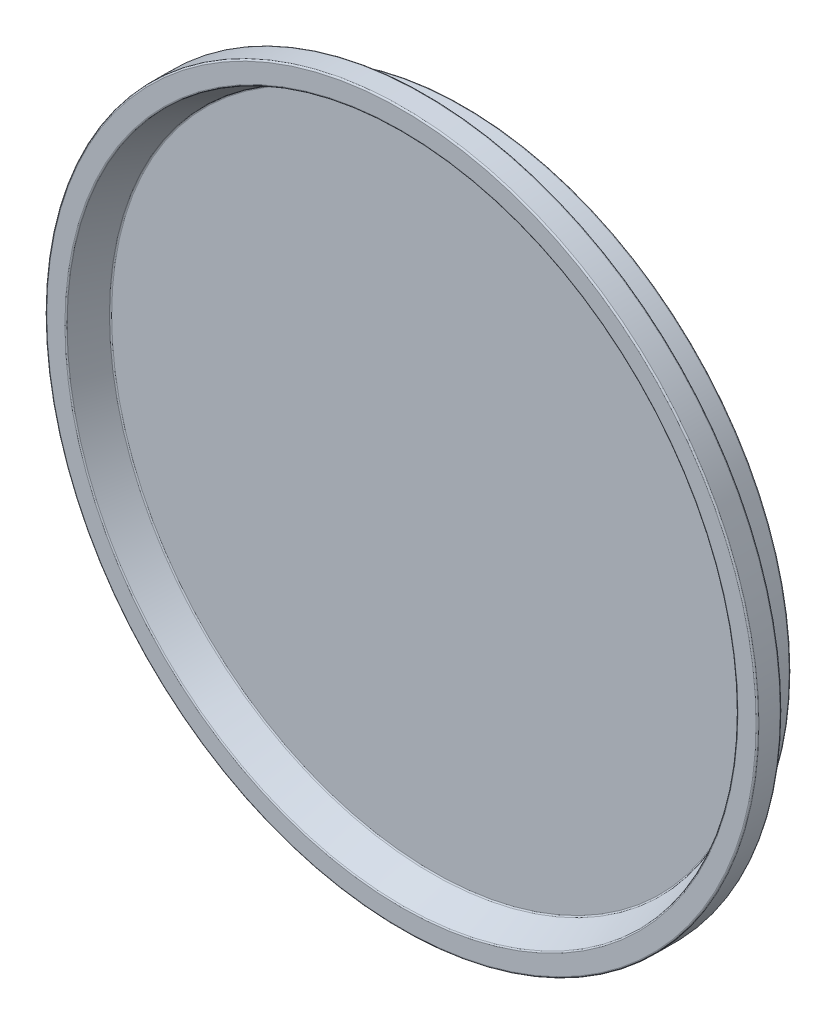
ISO-10303-21;
HEADER;
FILE_DESCRIPTION(('STEP AP214'),'2;1');
FILE_NAME('part.step','',(''),(''),'','','');
FILE_SCHEMA(('AUTOMOTIVE_DESIGN { 1 0 10303 214 1 1 1 1 }'));
ENDSEC;
DATA;
#1=APPLICATION_CONTEXT('core data for automotive mechanical design processes');
#2=APPLICATION_PROTOCOL_DEFINITION('international standard','automotive_design',2000,#1);
#3=PRODUCT_CONTEXT('',#1,'mechanical');
#4=PRODUCT('Part','Part','',(#3));
#5=PRODUCT_RELATED_PRODUCT_CATEGORY('part','',(#4));
#6=PRODUCT_DEFINITION_FORMATION('','',#4);
#7=PRODUCT_DEFINITION_CONTEXT('part definition',#1,'design');
#8=PRODUCT_DEFINITION('design','',#6,#7);
#9=PRODUCT_DEFINITION_SHAPE('','',#8);
#10=(LENGTH_UNIT() NAMED_UNIT(*) SI_UNIT(.MILLI.,.METRE.));
#11=(NAMED_UNIT(*) PLANE_ANGLE_UNIT() SI_UNIT($,.RADIAN.));
#12=(NAMED_UNIT(*) SI_UNIT($,.STERADIAN.) SOLID_ANGLE_UNIT());
#13=UNCERTAINTY_MEASURE_WITH_UNIT(LENGTH_MEASURE(1.E-05),#10,'distance_accuracy_value','');
#14=(GEOMETRIC_REPRESENTATION_CONTEXT(3) GLOBAL_UNCERTAINTY_ASSIGNED_CONTEXT((#13)) GLOBAL_UNIT_ASSIGNED_CONTEXT((#10,
#11,#12)) REPRESENTATION_CONTEXT('',''));
#15=CARTESIAN_POINT('',(0.,0.,0.));
#16=DIRECTION('',(0.,0.,1.));
#17=DIRECTION('',(1.,0.,0.));
#18=AXIS2_PLACEMENT_3D('',#15,#16,#17);
#19=CARTESIAN_POINT('',(0.,0.,2.19999999999998));
#20=DIRECTION('',(0.,0.,1.));
#21=DIRECTION('',(1.,0.,0.));
#22=AXIS2_PLACEMENT_3D('',#19,#20,#21);
#23=PLANE('',#22);
#24=CARTESIAN_POINT('',(0.,0.,2.19999999999998));
#25=DIRECTION('',(0.,0.,1.));
#26=DIRECTION('',(1.,0.,0.));
#27=AXIS2_PLACEMENT_3D('',#24,#25,#26);
#28=CIRCLE('',#27,169.038972539815);
#29=CARTESIAN_POINT('',(169.038972539815,0.,2.19999999999998));
#30=VERTEX_POINT('',#29);
#31=EDGE_CURVE('E10',#30,#30,#28,.T.);
#32=ORIENTED_EDGE('',*,*,#31,.T.);
#33=EDGE_LOOP('',(#32));
#34=FACE_BOUND('',#33,.T.);
#35=ADVANCED_FACE('F44',(#34),#23,.T.);
#36=CARTESIAN_POINT('',(0.,0.,18.796));
#37=DIRECTION('',(0.,0.,1.));
#38=DIRECTION('',(1.,0.,0.));
#39=AXIS2_PLACEMENT_3D('',#36,#37,#38);
#40=CONICAL_SURFACE('',#39,176.53,0.398379667033539);
#41=CARTESIAN_POINT('',(0.,0.,18.3295991595734));
#42=DIRECTION('',(0.,0.,-1.));
#43=DIRECTION('',(-1.,0.,0.));
#44=AXIS2_PLACEMENT_3D('',#41,#42,#43);
#45=CIRCLE('',#44,176.333699091927);
#46=CARTESIAN_POINT('',(-176.333699091927,0.,18.3295991595734));
#47=VERTEX_POINT('',#46);
#48=EDGE_CURVE('E52',#47,#47,#45,.F.);
#49=ORIENTED_EDGE('',*,*,#48,.T.);
#50=EDGE_LOOP('',(#49));
#51=FACE_BOUND('',#50,.T.);
#52=CARTESIAN_POINT('',(0.,0.,2.66640084042659));
#53=DIRECTION('',(0.,0.,1.));
#54=DIRECTION('',(1.,0.,0.));
#55=AXIS2_PLACEMENT_3D('',#52,#53,#54);
#56=CIRCLE('',#55,169.741300908073);
#57=CARTESIAN_POINT('',(169.741300908073,0.,2.66640084042659));
#58=VERTEX_POINT('',#57);
#59=EDGE_CURVE('E57',#58,#58,#56,.F.);
#60=ORIENTED_EDGE('',*,*,#59,.T.);
#61=EDGE_LOOP('',(#60));
#62=FACE_BOUND('',#61,.T.);
#63=ADVANCED_FACE('F161',(#51,#62),#40,.F.);
#64=CARTESIAN_POINT('',(-176.53,0.,18.796));
#65=DIRECTION('',(0.,0.,1.));
#66=DIRECTION('',(1.,0.,0.));
#67=AXIS2_PLACEMENT_3D('',#64,#65,#66);
#68=PLANE('',#67);
#69=CARTESIAN_POINT('',(0.,0.,18.796));
#70=DIRECTION('',(0.,0.,1.));
#71=DIRECTION('',(1.,0.,0.));
#72=AXIS2_PLACEMENT_3D('',#69,#70,#71);
#73=CIRCLE('',#72,177.036027460185);
#74=CARTESIAN_POINT('',(177.036027460185,0.,18.796));
#75=VERTEX_POINT('',#74);
#76=EDGE_CURVE('E62',#75,#75,#73,.F.);
#77=ORIENTED_EDGE('',*,*,#76,.T.);
#78=EDGE_LOOP('',(#77));
#79=FACE_BOUND('',#78,.T.);
#80=CARTESIAN_POINT('',(0.,0.,18.796));
#81=DIRECTION('',(0.,0.,1.));
#82=DIRECTION('',(1.,0.,0.));
#83=AXIS2_PLACEMENT_3D('',#80,#81,#82);
#84=CIRCLE('',#83,186.563);
#85=CARTESIAN_POINT('',(186.563,0.,18.796));
#86=VERTEX_POINT('',#85);
#87=EDGE_CURVE('E68',#86,#86,#84,.T.);
#88=ORIENTED_EDGE('',*,*,#87,.T.);
#89=EDGE_LOOP('',(#88));
#90=FACE_BOUND('',#89,.T.);
#91=ADVANCED_FACE('F164',(#79,#90),#68,.T.);
#92=CARTESIAN_POINT('',(0.,0.,0.));
#93=DIRECTION('',(0.,0.,-1.));
#94=DIRECTION('',(-1.,0.,0.));
#95=AXIS2_PLACEMENT_3D('',#92,#93,#94);
#96=CYLINDRICAL_SURFACE('',#95,187.325);
#97=CARTESIAN_POINT('',(0.,0.,6.858));
#98=DIRECTION('',(0.,0.,-1.));
#99=DIRECTION('',(-1.,0.,0.));
#100=AXIS2_PLACEMENT_3D('',#97,#98,#99);
#101=CIRCLE('',#100,187.325);
#102=CARTESIAN_POINT('',(-187.325,0.,6.858));
#103=VERTEX_POINT('',#102);
#104=EDGE_CURVE('E72',#103,#103,#101,.F.);
#105=ORIENTED_EDGE('',*,*,#104,.T.);
#106=EDGE_LOOP('',(#105));
#107=FACE_BOUND('',#106,.T.);
#108=CARTESIAN_POINT('',(0.,0.,18.034));
#109=DIRECTION('',(0.,0.,1.));
#110=DIRECTION('',(1.,0.,0.));
#111=AXIS2_PLACEMENT_3D('',#108,#109,#110);
#112=CIRCLE('',#111,187.325);
#113=CARTESIAN_POINT('',(187.325,0.,18.034));
#114=VERTEX_POINT('',#113);
#115=EDGE_CURVE('E76',#114,#114,#112,.F.);
#116=ORIENTED_EDGE('',*,*,#115,.T.);
#117=EDGE_LOOP('',(#116));
#118=FACE_BOUND('',#117,.T.);
#119=ADVANCED_FACE('F169',(#107,#118),#96,.T.);
#120=CARTESIAN_POINT('',(-187.325,0.,6.096));
#121=DIRECTION('',(0.,0.,-1.));
#122=DIRECTION('',(-1.,0.,0.));
#123=AXIS2_PLACEMENT_3D('',#120,#121,#122);
#124=PLANE('',#123);
#125=CARTESIAN_POINT('',(0.,0.,6.096));
#126=DIRECTION('',(0.,0.,-1.));
#127=DIRECTION('',(-1.,0.,0.));
#128=AXIS2_PLACEMENT_3D('',#125,#126,#127);
#129=CIRCLE('',#128,185.887);
#130=CARTESIAN_POINT('',(-185.887,0.,6.096));
#131=VERTEX_POINT('',#130);
#132=EDGE_CURVE('E80',#131,#131,#129,.F.);
#133=ORIENTED_EDGE('',*,*,#132,.T.);
#134=EDGE_LOOP('',(#133));
#135=FACE_BOUND('',#134,.T.);
#136=CARTESIAN_POINT('',(0.,0.,6.096));
#137=DIRECTION('',(0.,0.,-1.));
#138=DIRECTION('',(-1.,0.,0.));
#139=AXIS2_PLACEMENT_3D('',#136,#137,#138);
#140=CIRCLE('',#139,186.563);
#141=CARTESIAN_POINT('',(-186.563,0.,6.096));
#142=VERTEX_POINT('',#141);
#143=EDGE_CURVE('E84',#142,#142,#140,.T.);
#144=ORIENTED_EDGE('',*,*,#143,.T.);
#145=EDGE_LOOP('',(#144));
#146=FACE_BOUND('',#145,.T.);
#147=ADVANCED_FACE('F173',(#135,#146),#124,.T.);
#148=CARTESIAN_POINT('',(0.,0.,0.));
#149=DIRECTION('',(0.,0.,-1.));
#150=DIRECTION('',(-1.,0.,0.));
#151=AXIS2_PLACEMENT_3D('',#148,#149,#150);
#152=CYLINDRICAL_SURFACE('',#151,185.125);
#153=CARTESIAN_POINT('',(0.,0.,15.834));
#154=DIRECTION('',(0.,0.,-1.));
#155=DIRECTION('',(-1.,0.,0.));
#156=AXIS2_PLACEMENT_3D('',#153,#154,#155);
#157=CIRCLE('',#156,185.125);
#158=CARTESIAN_POINT('',(-185.125,0.,15.834));
#159=VERTEX_POINT('',#158);
#160=EDGE_CURVE('E88',#159,#159,#157,.F.);
#161=ORIENTED_EDGE('',*,*,#160,.T.);
#162=EDGE_LOOP('',(#161));
#163=FACE_BOUND('',#162,.T.);
#164=CARTESIAN_POINT('',(0.,0.,6.858));
#165=DIRECTION('',(0.,0.,-1.));
#166=DIRECTION('',(-1.,0.,0.));
#167=AXIS2_PLACEMENT_3D('',#164,#165,#166);
#168=CIRCLE('',#167,185.125);
#169=CARTESIAN_POINT('',(-185.125,0.,6.858));
#170=VERTEX_POINT('',#169);
#171=EDGE_CURVE('E92',#170,#170,#168,.T.);
#172=ORIENTED_EDGE('',*,*,#171,.T.);
#173=EDGE_LOOP('',(#172));
#174=FACE_BOUND('',#173,.T.);
#175=ADVANCED_FACE('F177',(#163,#174),#152,.F.);
#176=CARTESIAN_POINT('',(-185.125,0.,16.596));
#177=DIRECTION('',(0.,0.,-1.));
#178=DIRECTION('',(-1.,0.,0.));
#179=AXIS2_PLACEMENT_3D('',#176,#177,#178);
#180=PLANE('',#179);
#181=CARTESIAN_POINT('',(0.,0.,16.596));
#182=DIRECTION('',(0.,0.,-1.));
#183=DIRECTION('',(-1.,0.,0.));
#184=AXIS2_PLACEMENT_3D('',#181,#182,#183);
#185=CIRCLE('',#184,178.496999130009);
#186=CARTESIAN_POINT('',(-178.496999130009,0.,16.596));
#187=VERTEX_POINT('',#186);
#188=EDGE_CURVE('E96',#187,#187,#185,.F.);
#189=ORIENTED_EDGE('',*,*,#188,.T.);
#190=EDGE_LOOP('',(#189));
#191=FACE_BOUND('',#190,.T.);
#192=CARTESIAN_POINT('',(0.,0.,16.596));
#193=DIRECTION('',(0.,0.,-1.));
#194=DIRECTION('',(-1.,0.,0.));
#195=AXIS2_PLACEMENT_3D('',#192,#193,#194);
#196=CIRCLE('',#195,184.363);
#197=CARTESIAN_POINT('',(-184.363,0.,16.596));
#198=VERTEX_POINT('',#197);
#199=EDGE_CURVE('E100',#198,#198,#196,.T.);
#200=ORIENTED_EDGE('',*,*,#199,.T.);
#201=EDGE_LOOP('',(#200));
#202=FACE_BOUND('',#201,.T.);
#203=ADVANCED_FACE('F181',(#191,#202),#180,.T.);
#204=CARTESIAN_POINT('',(0.,0.,1.75589322370678));
#205=DIRECTION('',(0.,0.,1.));
#206=DIRECTION('',(1.,0.,0.));
#207=AXIS2_PLACEMENT_3D('',#204,#205,#206);
#208=CONICAL_SURFACE('',#207,171.745,0.398379667033535);
#209=CARTESIAN_POINT('',(0.,0.,1.89766994530952));
#210=DIRECTION('',(0.,0.,1.));
#211=DIRECTION('',(1.,0.,0.));
#212=AXIS2_PLACEMENT_3D('',#209,#210,#211);
#213=CIRCLE('',#212,171.804671631742);
#214=CARTESIAN_POINT('',(171.804671631742,0.,1.89766994530952));
#215=VERTEX_POINT('',#214);
#216=EDGE_CURVE('E104',#215,#215,#213,.T.);
#217=ORIENTED_EDGE('',*,*,#216,.T.);
#218=EDGE_LOOP('',(#217));
#219=FACE_BOUND('',#218,.T.);
#220=CARTESIAN_POINT('',(0.,0.,16.1295991595734));
#221=DIRECTION('',(0.,0.,1.));
#222=DIRECTION('',(1.,0.,0.));
#223=AXIS2_PLACEMENT_3D('',#220,#221,#222);
#224=CIRCLE('',#223,177.794670761751);
#225=CARTESIAN_POINT('',(177.794670761751,0.,16.1295991595734));
#226=VERTEX_POINT('',#225);
#227=EDGE_CURVE('E108',#226,#226,#224,.F.);
#228=ORIENTED_EDGE('',*,*,#227,.T.);
#229=EDGE_LOOP('',(#228));
#230=FACE_BOUND('',#229,.T.);
#231=ADVANCED_FACE('F185',(#219,#230),#208,.T.);
#232=CARTESIAN_POINT('',(0.,0.,0.));
#233=DIRECTION('',(0.,0.,-1.));
#234=DIRECTION('',(-1.,0.,0.));
#235=AXIS2_PLACEMENT_3D('',#232,#233,#234);
#236=CYLINDRICAL_SURFACE('',#235,171.745);
#237=CARTESIAN_POINT('',(0.,0.,-13.462));
#238=DIRECTION('',(0.,0.,-1.));
#239=DIRECTION('',(-1.,0.,0.));
#240=AXIS2_PLACEMENT_3D('',#237,#238,#239);
#241=CIRCLE('',#240,171.745);
#242=CARTESIAN_POINT('',(-171.745,0.,-13.462));
#243=VERTEX_POINT('',#242);
#244=EDGE_CURVE('E112',#243,#243,#241,.F.);
#245=ORIENTED_EDGE('',*,*,#244,.T.);
#246=EDGE_LOOP('',(#245));
#247=FACE_BOUND('',#246,.T.);
#248=CARTESIAN_POINT('',(0.,0.,1.60207078573614));
#249=DIRECTION('',(0.,0.,-1.));
#250=DIRECTION('',(-1.,0.,0.));
#251=AXIS2_PLACEMENT_3D('',#248,#249,#250);
#252=CIRCLE('',#251,171.745);
#253=CARTESIAN_POINT('',(-171.745,0.,1.60207078573614));
#254=VERTEX_POINT('',#253);
#255=EDGE_CURVE('E116',#254,#254,#252,.T.);
#256=ORIENTED_EDGE('',*,*,#255,.T.);
#257=EDGE_LOOP('',(#256));
#258=FACE_BOUND('',#257,.T.);
#259=ADVANCED_FACE('F189',(#247,#258),#236,.T.);
#260=CARTESIAN_POINT('',(-171.745,0.,-14.224));
#261=DIRECTION('',(0.,0.,-1.));
#262=DIRECTION('',(-1.,0.,0.));
#263=AXIS2_PLACEMENT_3D('',#260,#261,#262);
#264=PLANE('',#263);
#265=CARTESIAN_POINT('',(0.,0.,-14.224));
#266=DIRECTION('',(0.,0.,-1.));
#267=DIRECTION('',(-1.,0.,0.));
#268=AXIS2_PLACEMENT_3D('',#265,#266,#267);
#269=CIRCLE('',#268,170.307);
#270=CARTESIAN_POINT('',(-170.307,0.,-14.224));
#271=VERTEX_POINT('',#270);
#272=EDGE_CURVE('E120',#271,#271,#269,.F.);
#273=ORIENTED_EDGE('',*,*,#272,.T.);
#274=EDGE_LOOP('',(#273));
#275=FACE_BOUND('',#274,.T.);
#276=CARTESIAN_POINT('',(0.,0.,-14.224));
#277=DIRECTION('',(0.,0.,-1.));
#278=DIRECTION('',(-1.,0.,0.));
#279=AXIS2_PLACEMENT_3D('',#276,#277,#278);
#280=CIRCLE('',#279,170.983);
#281=CARTESIAN_POINT('',(-170.983,0.,-14.224));
#282=VERTEX_POINT('',#281);
#283=EDGE_CURVE('E124',#282,#282,#280,.T.);
#284=ORIENTED_EDGE('',*,*,#283,.T.);
#285=EDGE_LOOP('',(#284));
#286=FACE_BOUND('',#285,.T.);
#287=ADVANCED_FACE('F193',(#275,#286),#264,.T.);
#288=CARTESIAN_POINT('',(0.,0.,0.));
#289=DIRECTION('',(0.,0.,-1.));
#290=DIRECTION('',(-1.,0.,0.));
#291=AXIS2_PLACEMENT_3D('',#288,#289,#290);
#292=CYLINDRICAL_SURFACE('',#291,169.545);
#293=CARTESIAN_POINT('',(0.,0.,-0.761999999999999));
#294=DIRECTION('',(0.,0.,-1.));
#295=DIRECTION('',(-1.,0.,0.));
#296=AXIS2_PLACEMENT_3D('',#293,#294,#295);
#297=CIRCLE('',#296,169.545);
#298=CARTESIAN_POINT('',(-169.545,0.,-0.761999999999999));
#299=VERTEX_POINT('',#298);
#300=EDGE_CURVE('E128',#299,#299,#297,.F.);
#301=ORIENTED_EDGE('',*,*,#300,.T.);
#302=EDGE_LOOP('',(#301));
#303=FACE_BOUND('',#302,.T.);
#304=CARTESIAN_POINT('',(0.,0.,-13.462));
#305=DIRECTION('',(0.,0.,-1.));
#306=DIRECTION('',(-1.,0.,0.));
#307=AXIS2_PLACEMENT_3D('',#304,#305,#306);
#308=CIRCLE('',#307,169.545);
#309=CARTESIAN_POINT('',(-169.545,0.,-13.462));
#310=VERTEX_POINT('',#309);
#311=EDGE_CURVE('E132',#310,#310,#308,.T.);
#312=ORIENTED_EDGE('',*,*,#311,.T.);
#313=EDGE_LOOP('',(#312));
#314=FACE_BOUND('',#313,.T.);
#315=ADVANCED_FACE('F156',(#303,#314),#292,.F.);
#316=CARTESIAN_POINT('',(-169.545,0.,0.));
#317=DIRECTION('',(0.,0.,-1.));
#318=DIRECTION('',(-1.,0.,0.));
#319=AXIS2_PLACEMENT_3D('',#316,#317,#318);
#320=PLANE('',#319);
#321=CARTESIAN_POINT('',(0.,0.,0.));
#322=DIRECTION('',(0.,0.,-1.));
#323=DIRECTION('',(-1.,0.,0.));
#324=AXIS2_PLACEMENT_3D('',#321,#322,#323);
#325=CIRCLE('',#324,168.783);
#326=CARTESIAN_POINT('',(-168.783,0.,0.));
#327=VERTEX_POINT('',#326);
#328=EDGE_CURVE('E136',#327,#327,#325,.T.);
#329=ORIENTED_EDGE('',*,*,#328,.T.);
#330=EDGE_LOOP('',(#329));
#331=FACE_BOUND('',#330,.T.);
#332=ADVANCED_FACE('F141',(#331),#320,.T.);
#333=CARTESIAN_POINT('',(0.,0.,-0.761999999999999));
#334=DIRECTION('',(0.,0.,-1.));
#335=DIRECTION('',(-1.,0.,0.));
#336=AXIS2_PLACEMENT_3D('',#333,#334,#335);
#337=TOROIDAL_SURFACE('',#336,168.783,0.762);
#338=ORIENTED_EDGE('',*,*,#300,.F.);
#339=EDGE_LOOP('',(#338));
#340=FACE_BOUND('',#339,.T.);
#341=ORIENTED_EDGE('',*,*,#328,.F.);
#342=EDGE_LOOP('',(#341));
#343=FACE_BOUND('',#342,.T.);
#344=ADVANCED_FACE('F143',(#340,#343),#337,.F.);
#345=CARTESIAN_POINT('',(0.,0.,-13.462));
#346=DIRECTION('',(0.,0.,-1.));
#347=DIRECTION('',(-1.,0.,0.));
#348=AXIS2_PLACEMENT_3D('',#345,#346,#347);
#349=TOROIDAL_SURFACE('',#348,170.307,0.762);
#350=ORIENTED_EDGE('',*,*,#272,.F.);
#351=EDGE_LOOP('',(#350));
#352=FACE_BOUND('',#351,.T.);
#353=ORIENTED_EDGE('',*,*,#311,.F.);
#354=EDGE_LOOP('',(#353));
#355=FACE_BOUND('',#354,.T.);
#356=ADVANCED_FACE('F145',(#352,#355),#349,.T.);
#357=CARTESIAN_POINT('',(0.,0.,-13.462));
#358=DIRECTION('',(0.,0.,-1.));
#359=DIRECTION('',(-1.,0.,0.));
#360=AXIS2_PLACEMENT_3D('',#357,#358,#359);
#361=TOROIDAL_SURFACE('',#360,170.983,0.762);
#362=ORIENTED_EDGE('',*,*,#244,.F.);
#363=EDGE_LOOP('',(#362));
#364=FACE_BOUND('',#363,.T.);
#365=ORIENTED_EDGE('',*,*,#283,.F.);
#366=EDGE_LOOP('',(#365));
#367=FACE_BOUND('',#366,.T.);
#368=ADVANCED_FACE('F152',(#364,#367),#361,.T.);
#369=CARTESIAN_POINT('',(0.,0.,1.60207078573614));
#370=DIRECTION('',(0.,0.,-1.));
#371=DIRECTION('',(-1.,0.,0.));
#372=AXIS2_PLACEMENT_3D('',#369,#370,#371);
#373=TOROIDAL_SURFACE('',#372,172.507,0.762);
#374=ORIENTED_EDGE('',*,*,#216,.F.);
#375=EDGE_LOOP('',(#374));
#376=FACE_BOUND('',#375,.T.);
#377=ORIENTED_EDGE('',*,*,#255,.F.);
#378=EDGE_LOOP('',(#377));
#379=FACE_BOUND('',#378,.T.);
#380=ADVANCED_FACE('F246',(#376,#379),#373,.F.);
#381=CARTESIAN_POINT('',(0.,0.,15.834));
#382=DIRECTION('',(0.,0.,-1.));
#383=DIRECTION('',(-1.,0.,0.));
#384=AXIS2_PLACEMENT_3D('',#381,#382,#383);
#385=TOROIDAL_SURFACE('',#384,178.496999130009,0.762);
#386=ORIENTED_EDGE('',*,*,#188,.F.);
#387=EDGE_LOOP('',(#386));
#388=FACE_BOUND('',#387,.T.);
#389=ORIENTED_EDGE('',*,*,#227,.F.);
#390=EDGE_LOOP('',(#389));
#391=FACE_BOUND('',#390,.T.);
#392=ADVANCED_FACE('F256',(#388,#391),#385,.F.);
#393=CARTESIAN_POINT('',(0.,0.,15.834));
#394=DIRECTION('',(0.,0.,-1.));
#395=DIRECTION('',(-1.,0.,0.));
#396=AXIS2_PLACEMENT_3D('',#393,#394,#395);
#397=TOROIDAL_SURFACE('',#396,184.363,0.762);
#398=ORIENTED_EDGE('',*,*,#160,.F.);
#399=EDGE_LOOP('',(#398));
#400=FACE_BOUND('',#399,.T.);
#401=ORIENTED_EDGE('',*,*,#199,.F.);
#402=EDGE_LOOP('',(#401));
#403=FACE_BOUND('',#402,.T.);
#404=ADVANCED_FACE('F266',(#400,#403),#397,.F.);
#405=CARTESIAN_POINT('',(0.,0.,6.858));
#406=DIRECTION('',(0.,0.,-1.));
#407=DIRECTION('',(-1.,0.,0.));
#408=AXIS2_PLACEMENT_3D('',#405,#406,#407);
#409=TOROIDAL_SURFACE('',#408,185.887,0.762);
#410=ORIENTED_EDGE('',*,*,#132,.F.);
#411=EDGE_LOOP('',(#410));
#412=FACE_BOUND('',#411,.T.);
#413=ORIENTED_EDGE('',*,*,#171,.F.);
#414=EDGE_LOOP('',(#413));
#415=FACE_BOUND('',#414,.T.);
#416=ADVANCED_FACE('F276',(#412,#415),#409,.T.);
#417=CARTESIAN_POINT('',(0.,0.,6.858));
#418=DIRECTION('',(0.,0.,-1.));
#419=DIRECTION('',(-1.,0.,0.));
#420=AXIS2_PLACEMENT_3D('',#417,#418,#419);
#421=TOROIDAL_SURFACE('',#420,186.563,0.762);
#422=ORIENTED_EDGE('',*,*,#104,.F.);
#423=EDGE_LOOP('',(#422));
#424=FACE_BOUND('',#423,.T.);
#425=ORIENTED_EDGE('',*,*,#143,.F.);
#426=EDGE_LOOP('',(#425));
#427=FACE_BOUND('',#426,.T.);
#428=ADVANCED_FACE('F286',(#424,#427),#421,.T.);
#429=CARTESIAN_POINT('',(0.,0.,18.034));
#430=DIRECTION('',(0.,0.,1.));
#431=DIRECTION('',(1.,0.,0.));
#432=AXIS2_PLACEMENT_3D('',#429,#430,#431);
#433=TOROIDAL_SURFACE('',#432,177.036027460185,0.762);
#434=ORIENTED_EDGE('',*,*,#48,.F.);
#435=EDGE_LOOP('',(#434));
#436=FACE_BOUND('',#435,.T.);
#437=ORIENTED_EDGE('',*,*,#76,.F.);
#438=EDGE_LOOP('',(#437));
#439=FACE_BOUND('',#438,.T.);
#440=ADVANCED_FACE('F296',(#436,#439),#433,.T.);
#441=CARTESIAN_POINT('',(0.,0.,2.96199999999998));
#442=DIRECTION('',(0.,0.,1.));
#443=DIRECTION('',(1.,0.,0.));
#444=AXIS2_PLACEMENT_3D('',#441,#442,#443);
#445=TOROIDAL_SURFACE('',#444,169.038972539815,0.762);
#446=ORIENTED_EDGE('',*,*,#31,.F.);
#447=EDGE_LOOP('',(#446));
#448=FACE_BOUND('',#447,.T.);
#449=ORIENTED_EDGE('',*,*,#59,.F.);
#450=EDGE_LOOP('',(#449));
#451=FACE_BOUND('',#450,.T.);
#452=ADVANCED_FACE('F306',(#448,#451),#445,.F.);
#453=CARTESIAN_POINT('',(0.,0.,18.034));
#454=DIRECTION('',(0.,0.,1.));
#455=DIRECTION('',(1.,0.,0.));
#456=AXIS2_PLACEMENT_3D('',#453,#454,#455);
#457=TOROIDAL_SURFACE('',#456,186.563,0.762);
#458=ORIENTED_EDGE('',*,*,#87,.F.);
#459=EDGE_LOOP('',(#458));
#460=FACE_BOUND('',#459,.T.);
#461=ORIENTED_EDGE('',*,*,#115,.F.);
#462=EDGE_LOOP('',(#461));
#463=FACE_BOUND('',#462,.T.);
#464=ADVANCED_FACE('F46',(#460,#463),#457,.T.);
#465=CLOSED_SHELL('',(#35,#63,#91,#119,#147,#175,#203,#231,#259,#287,#315,#332,#344,#356,#368,
#380,#392,#404,#416,#428,#440,#452,#464));
#466=MANIFOLD_SOLID_BREP('B2',#465);
#467=ADVANCED_BREP_SHAPE_REPRESENTATION('',(#18,#466),#14);
#468=SHAPE_DEFINITION_REPRESENTATION(#9,#467);
ENDSEC;
END-ISO-10303-21;
